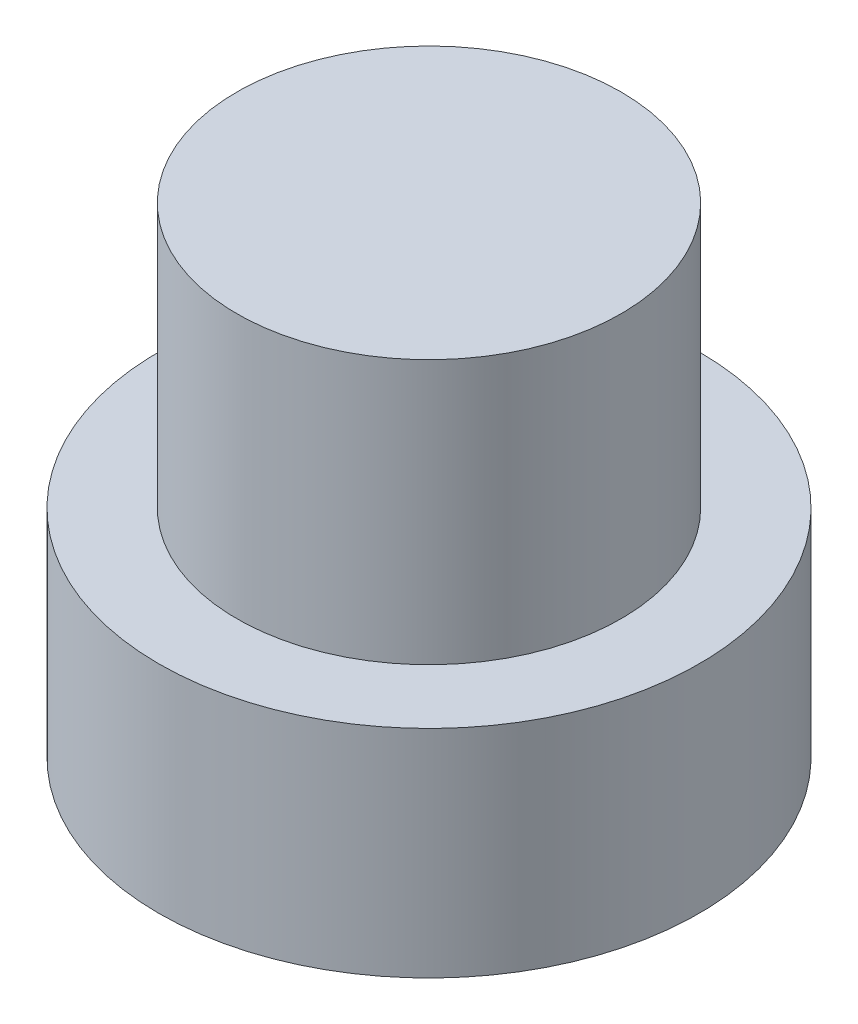
ISO-10303-21;
HEADER;
FILE_DESCRIPTION(('STEP AP214'),'2;1');
FILE_NAME('part.step','',(''),(''),'','','');
FILE_SCHEMA(('AUTOMOTIVE_DESIGN { 1 0 10303 214 1 1 1 1 }'));
ENDSEC;
DATA;
#1=APPLICATION_CONTEXT('core data for automotive mechanical design processes');
#2=APPLICATION_PROTOCOL_DEFINITION('international standard','automotive_design',2000,#1);
#3=PRODUCT_CONTEXT('',#1,'mechanical');
#4=PRODUCT('Part','Part','',(#3));
#5=PRODUCT_RELATED_PRODUCT_CATEGORY('part','',(#4));
#6=PRODUCT_DEFINITION_FORMATION('','',#4);
#7=PRODUCT_DEFINITION_CONTEXT('part definition',#1,'design');
#8=PRODUCT_DEFINITION('design','',#6,#7);
#9=PRODUCT_DEFINITION_SHAPE('','',#8);
#10=(LENGTH_UNIT() NAMED_UNIT(*) SI_UNIT(.MILLI.,.METRE.));
#11=(NAMED_UNIT(*) PLANE_ANGLE_UNIT() SI_UNIT($,.RADIAN.));
#12=(NAMED_UNIT(*) SI_UNIT($,.STERADIAN.) SOLID_ANGLE_UNIT());
#13=UNCERTAINTY_MEASURE_WITH_UNIT(LENGTH_MEASURE(1.E-05),#10,'distance_accuracy_value','');
#14=(GEOMETRIC_REPRESENTATION_CONTEXT(3) GLOBAL_UNCERTAINTY_ASSIGNED_CONTEXT((#13)) GLOBAL_UNIT_ASSIGNED_CONTEXT((#10,
#11,#12)) REPRESENTATION_CONTEXT('',''));
#15=CARTESIAN_POINT('',(0.,0.,0.));
#16=DIRECTION('',(0.,0.,1.));
#17=DIRECTION('',(1.,0.,0.));
#18=AXIS2_PLACEMENT_3D('',#15,#16,#17);
#19=CARTESIAN_POINT('',(0.,0.,0.));
#20=DIRECTION('',(0.,-1.,0.));
#21=DIRECTION('',(0.,0.,-1.));
#22=AXIS2_PLACEMENT_3D('',#19,#20,#21);
#23=PLANE('',#22);
#24=CARTESIAN_POINT('',(0.,0.,0.));
#25=DIRECTION('',(0.,-1.,0.));
#26=DIRECTION('',(0.,0.,-1.));
#27=AXIS2_PLACEMENT_3D('',#24,#25,#26);
#28=CIRCLE('',#27,22.5);
#29=CARTESIAN_POINT('',(0.,0.,-22.5));
#30=VERTEX_POINT('',#29);
#31=EDGE_CURVE('E10',#30,#30,#28,.T.);
#32=ORIENTED_EDGE('',*,*,#31,.T.);
#33=EDGE_LOOP('',(#32));
#34=FACE_BOUND('',#33,.T.);
#35=ADVANCED_FACE('F36',(#34),#23,.T.);
#36=CARTESIAN_POINT('',(0.,0.,0.));
#37=DIRECTION('',(0.,-1.,0.));
#38=DIRECTION('',(0.,0.,-1.));
#39=AXIS2_PLACEMENT_3D('',#36,#37,#38);
#40=CYLINDRICAL_SURFACE('',#39,22.5);
#41=CARTESIAN_POINT('',(0.,18.,0.));
#42=DIRECTION('',(0.,-1.,0.));
#43=DIRECTION('',(0.,0.,-1.));
#44=AXIS2_PLACEMENT_3D('',#41,#42,#43);
#45=CIRCLE('',#44,22.5);
#46=CARTESIAN_POINT('',(0.,18.,-22.5));
#47=VERTEX_POINT('',#46);
#48=EDGE_CURVE('E44',#47,#47,#45,.T.);
#49=ORIENTED_EDGE('',*,*,#48,.T.);
#50=EDGE_LOOP('',(#49));
#51=FACE_BOUND('',#50,.T.);
#52=ORIENTED_EDGE('',*,*,#31,.F.);
#53=EDGE_LOOP('',(#52));
#54=FACE_BOUND('',#53,.T.);
#55=ADVANCED_FACE('F104',(#51,#54),#40,.T.);
#56=CARTESIAN_POINT('',(22.5,18.,0.));
#57=DIRECTION('',(0.,1.,0.));
#58=DIRECTION('',(0.,0.,1.));
#59=AXIS2_PLACEMENT_3D('',#56,#57,#58);
#60=PLANE('',#59);
#61=CARTESIAN_POINT('',(0.,18.,0.));
#62=DIRECTION('',(0.,-1.,0.));
#63=DIRECTION('',(0.,0.,-1.));
#64=AXIS2_PLACEMENT_3D('',#61,#62,#63);
#65=CIRCLE('',#64,16.);
#66=CARTESIAN_POINT('',(0.,18.,-16.));
#67=VERTEX_POINT('',#66);
#68=EDGE_CURVE('E47',#67,#67,#65,.T.);
#69=ORIENTED_EDGE('',*,*,#68,.T.);
#70=EDGE_LOOP('',(#69));
#71=FACE_BOUND('',#70,.T.);
#72=ORIENTED_EDGE('',*,*,#48,.F.);
#73=EDGE_LOOP('',(#72));
#74=FACE_BOUND('',#73,.T.);
#75=ADVANCED_FACE('F105',(#71,#74),#60,.T.);
#76=CARTESIAN_POINT('',(0.,0.,0.));
#77=DIRECTION('',(0.,-1.,0.));
#78=DIRECTION('',(0.,0.,-1.));
#79=AXIS2_PLACEMENT_3D('',#76,#77,#78);
#80=CYLINDRICAL_SURFACE('',#79,16.);
#81=CARTESIAN_POINT('',(0.,40.,0.));
#82=DIRECTION('',(0.,-1.,0.));
#83=DIRECTION('',(0.,0.,-1.));
#84=AXIS2_PLACEMENT_3D('',#81,#82,#83);
#85=CIRCLE('',#84,16.);
#86=CARTESIAN_POINT('',(0.,40.,-16.));
#87=VERTEX_POINT('',#86);
#88=EDGE_CURVE('E52',#87,#87,#85,.T.);
#89=ORIENTED_EDGE('',*,*,#88,.T.);
#90=EDGE_LOOP('',(#89));
#91=FACE_BOUND('',#90,.T.);
#92=ORIENTED_EDGE('',*,*,#68,.F.);
#93=EDGE_LOOP('',(#92));
#94=FACE_BOUND('',#93,.T.);
#95=ADVANCED_FACE('F98',(#91,#94),#80,.T.);
#96=CARTESIAN_POINT('',(16.,40.,0.));
#97=DIRECTION('',(0.,1.,0.));
#98=DIRECTION('',(0.,0.,1.));
#99=AXIS2_PLACEMENT_3D('',#96,#97,#98);
#100=PLANE('',#99);
#101=ORIENTED_EDGE('',*,*,#88,.F.);
#102=EDGE_LOOP('',(#101));
#103=FACE_BOUND('',#102,.T.);
#104=ADVANCED_FACE('F96',(#103),#100,.T.);
#105=CLOSED_SHELL('',(#35,#55,#75,#95,#104));
#106=CARTESIAN_POINT('',(14.5,38.5,0.));
#107=DIRECTION('',(0.,-1.,0.));
#108=DIRECTION('',(0.,0.,-1.));
#109=AXIS2_PLACEMENT_3D('',#106,#107,#108);
#110=PLANE('',#109);
#111=CARTESIAN_POINT('',(0.,38.5,0.));
#112=DIRECTION('',(0.,-1.,0.));
#113=DIRECTION('',(0.,0.,-1.));
#114=AXIS2_PLACEMENT_3D('',#111,#112,#113);
#115=CIRCLE('',#114,14.5);
#116=CARTESIAN_POINT('',(0.,38.5,-14.5));
#117=VERTEX_POINT('',#116);
#118=EDGE_CURVE('E59',#117,#117,#115,.T.);
#119=ORIENTED_EDGE('',*,*,#118,.T.);
#120=EDGE_LOOP('',(#119));
#121=FACE_BOUND('',#120,.T.);
#122=ADVANCED_FACE('F84',(#121),#110,.T.);
#123=CARTESIAN_POINT('',(0.,0.,0.));
#124=DIRECTION('',(0.,-1.,0.));
#125=DIRECTION('',(0.,0.,-1.));
#126=AXIS2_PLACEMENT_3D('',#123,#124,#125);
#127=CYLINDRICAL_SURFACE('',#126,14.5);
#128=CARTESIAN_POINT('',(0.,16.5,0.));
#129=DIRECTION('',(0.,-1.,0.));
#130=DIRECTION('',(0.,0.,-1.));
#131=AXIS2_PLACEMENT_3D('',#128,#129,#130);
#132=CIRCLE('',#131,14.5);
#133=CARTESIAN_POINT('',(0.,16.5,-14.5));
#134=VERTEX_POINT('',#133);
#135=EDGE_CURVE('E62',#134,#134,#132,.T.);
#136=ORIENTED_EDGE('',*,*,#135,.T.);
#137=EDGE_LOOP('',(#136));
#138=FACE_BOUND('',#137,.T.);
#139=ORIENTED_EDGE('',*,*,#118,.F.);
#140=EDGE_LOOP('',(#139));
#141=FACE_BOUND('',#140,.T.);
#142=ADVANCED_FACE('F83',(#138,#141),#127,.F.);
#143=CARTESIAN_POINT('',(21.,16.5,0.));
#144=DIRECTION('',(0.,-1.,0.));
#145=DIRECTION('',(0.,0.,-1.));
#146=AXIS2_PLACEMENT_3D('',#143,#144,#145);
#147=PLANE('',#146);
#148=CARTESIAN_POINT('',(0.,16.5,0.));
#149=DIRECTION('',(0.,-1.,0.));
#150=DIRECTION('',(0.,0.,-1.));
#151=AXIS2_PLACEMENT_3D('',#148,#149,#150);
#152=CIRCLE('',#151,21.);
#153=CARTESIAN_POINT('',(0.,16.5,-21.));
#154=VERTEX_POINT('',#153);
#155=EDGE_CURVE('E61',#154,#154,#152,.T.);
#156=ORIENTED_EDGE('',*,*,#155,.T.);
#157=EDGE_LOOP('',(#156));
#158=FACE_BOUND('',#157,.T.);
#159=ORIENTED_EDGE('',*,*,#135,.F.);
#160=EDGE_LOOP('',(#159));
#161=FACE_BOUND('',#160,.T.);
#162=ADVANCED_FACE('F82',(#158,#161),#147,.T.);
#163=CARTESIAN_POINT('',(0.,0.,0.));
#164=DIRECTION('',(0.,-1.,0.));
#165=DIRECTION('',(0.,0.,-1.));
#166=AXIS2_PLACEMENT_3D('',#163,#164,#165);
#167=CYLINDRICAL_SURFACE('',#166,21.);
#168=CARTESIAN_POINT('',(0.,1.5,0.));
#169=DIRECTION('',(0.,-1.,0.));
#170=DIRECTION('',(0.,0.,-1.));
#171=AXIS2_PLACEMENT_3D('',#168,#169,#170);
#172=CIRCLE('',#171,21.);
#173=CARTESIAN_POINT('',(0.,1.5,-21.));
#174=VERTEX_POINT('',#173);
#175=EDGE_CURVE('E70',#174,#174,#172,.T.);
#176=ORIENTED_EDGE('',*,*,#175,.T.);
#177=EDGE_LOOP('',(#176));
#178=FACE_BOUND('',#177,.T.);
#179=ORIENTED_EDGE('',*,*,#155,.F.);
#180=EDGE_LOOP('',(#179));
#181=FACE_BOUND('',#180,.T.);
#182=ADVANCED_FACE('F72',(#178,#181),#167,.F.);
#183=CARTESIAN_POINT('',(1.5,1.5,0.));
#184=DIRECTION('',(0.,1.,0.));
#185=DIRECTION('',(0.,0.,1.));
#186=AXIS2_PLACEMENT_3D('',#183,#184,#185);
#187=PLANE('',#186);
#188=ORIENTED_EDGE('',*,*,#175,.F.);
#189=EDGE_LOOP('',(#188));
#190=FACE_BOUND('',#189,.T.);
#191=ADVANCED_FACE('F74',(#190),#187,.T.);
#192=CLOSED_SHELL('',(#122,#142,#162,#182,#191));
#193=ORIENTED_CLOSED_SHELL('',*,#192,.T.);
#194=BREP_WITH_VOIDS('B2',#105,(#193));
#195=ADVANCED_BREP_SHAPE_REPRESENTATION('',(#18,#194),#14);
#196=SHAPE_DEFINITION_REPRESENTATION(#9,#195);
ENDSEC;
END-ISO-10303-21;
